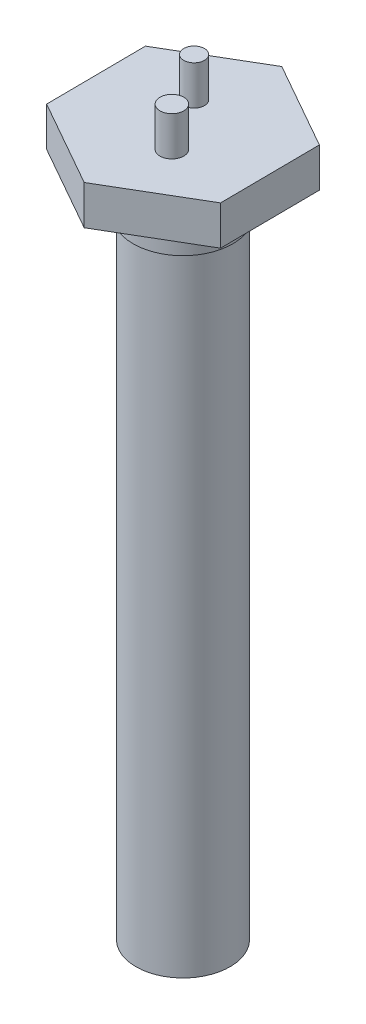
ISO-10303-21;
HEADER;
FILE_DESCRIPTION(('STEP AP214'),'2;1');
FILE_NAME('part.step','',(''),(''),'','','');
FILE_SCHEMA(('AUTOMOTIVE_DESIGN { 1 0 10303 214 1 1 1 1 }'));
ENDSEC;
DATA;
#1=APPLICATION_CONTEXT('core data for automotive mechanical design processes');
#2=APPLICATION_PROTOCOL_DEFINITION('international standard','automotive_design',2000,#1);
#3=PRODUCT_CONTEXT('',#1,'mechanical');
#4=PRODUCT('Part','Part','',(#3));
#5=PRODUCT_RELATED_PRODUCT_CATEGORY('part','',(#4));
#6=PRODUCT_DEFINITION_FORMATION('','',#4);
#7=PRODUCT_DEFINITION_CONTEXT('part definition',#1,'design');
#8=PRODUCT_DEFINITION('design','',#6,#7);
#9=PRODUCT_DEFINITION_SHAPE('','',#8);
#10=(LENGTH_UNIT() NAMED_UNIT(*) SI_UNIT(.MILLI.,.METRE.));
#11=(NAMED_UNIT(*) PLANE_ANGLE_UNIT() SI_UNIT($,.RADIAN.));
#12=(NAMED_UNIT(*) SI_UNIT($,.STERADIAN.) SOLID_ANGLE_UNIT());
#13=UNCERTAINTY_MEASURE_WITH_UNIT(LENGTH_MEASURE(1.E-05),#10,'distance_accuracy_value','');
#14=(GEOMETRIC_REPRESENTATION_CONTEXT(3) GLOBAL_UNCERTAINTY_ASSIGNED_CONTEXT((#13)) GLOBAL_UNIT_ASSIGNED_CONTEXT((#10,
#11,#12)) REPRESENTATION_CONTEXT('',''));
#15=CARTESIAN_POINT('',(0.,0.,0.));
#16=DIRECTION('',(0.,0.,1.));
#17=DIRECTION('',(1.,0.,0.));
#18=AXIS2_PLACEMENT_3D('',#15,#16,#17);
#19=CARTESIAN_POINT('',(3.81496896743502,180.,-6.73507861425368));
#20=DIRECTION('',(0.492858489126997,0.,-0.870109481442108));
#21=DIRECTION('',(-0.870109481442108,0.,-0.492858489126997));
#22=AXIS2_PLACEMENT_3D('',#19,#20,#21);
#23=PLANE('',#22);
#24=DIRECTION('',(0.,-1.,0.));
#25=VECTOR('',#24,1.);
#26=CARTESIAN_POINT('',(-30.4800376698685,180.,-26.1608928552934));
#27=LINE('',#26,#25);
#28=CARTESIAN_POINT('',(-30.4800376698685,180.,-26.1608928552934));
#29=VERTEX_POINT('',#28);
#30=CARTESIAN_POINT('',(-30.4800376698685,170.,-26.1608928552934));
#31=VERTEX_POINT('',#30);
#32=EDGE_CURVE('E127',#29,#31,#27,.T.);
#33=ORIENTED_EDGE('',*,*,#32,.T.);
#34=DIRECTION('',(0.870109481442108,0.,0.492858489126997));
#35=VECTOR('',#34,1.);
#36=CARTESIAN_POINT('',(3.81496896743502,170.,-6.73507861425368));
#37=LINE('',#36,#35);
#38=CARTESIAN_POINT('',(-8.37925684123895,170.,-13.6422872314676));
#39=VERTEX_POINT('',#38);
#40=EDGE_CURVE('E77',#31,#39,#37,.T.);
#41=ORIENTED_EDGE('',*,*,#40,.T.);
#42=DIRECTION('',(0.,-1.,0.));
#43=VECTOR('',#42,1.);
#44=CARTESIAN_POINT('',(-8.37925684123895,180.,-13.6422872314676));
#45=LINE('',#44,#43);
#46=CARTESIAN_POINT('',(-8.37925684123895,180.,-13.6422872314676));
#47=VERTEX_POINT('',#46);
#48=EDGE_CURVE('E12',#47,#39,#45,.T.);
#49=ORIENTED_EDGE('',*,*,#48,.F.);
#50=DIRECTION('',(0.870109481442108,0.,0.492858489126997));
#51=VECTOR('',#50,1.);
#52=CARTESIAN_POINT('',(3.81496896743502,180.,-6.73507861425368));
#53=LINE('',#52,#51);
#54=EDGE_CURVE('E136',#29,#47,#53,.T.);
#55=ORIENTED_EDGE('',*,*,#54,.F.);
#56=EDGE_LOOP('',(#33,#41,#49,#55));
#57=FACE_BOUND('',#56,.T.);
#58=ADVANCED_FACE('F62',(#57),#23,.F.);
#59=CARTESIAN_POINT('',(-8.11739263698819,180.,-13.7963608015956));
#60=DIRECTION('',(-0.507107670439071,0.,-0.86188271277585));
#61=DIRECTION('',(-0.86188271277585,0.,0.507107670439071));
#62=AXIS2_PLACEMENT_3D('',#59,#60,#61);
#63=PLANE('',#62);
#64=ORIENTED_EDGE('',*,*,#48,.T.);
#65=DIRECTION('',(0.86188271277585,0.,-0.507107670439071));
#66=VECTOR('',#65,1.);
#67=CARTESIAN_POINT('',(-8.11739263698819,170.,-13.7963608015956));
#68=LINE('',#67,#66);
#69=CARTESIAN_POINT('',(13.5125640632677,170.,-26.5228220606201));
#70=VERTEX_POINT('',#69);
#71=EDGE_CURVE('E114',#39,#70,#68,.T.);
#72=ORIENTED_EDGE('',*,*,#71,.T.);
#73=DIRECTION('',(0.,-1.,0.));
#74=VECTOR('',#73,1.);
#75=CARTESIAN_POINT('',(13.5125640632677,180.,-26.5228220606201));
#76=LINE('',#75,#74);
#77=CARTESIAN_POINT('',(13.5125640632677,180.,-26.5228220606201));
#78=VERTEX_POINT('',#77);
#79=EDGE_CURVE('E70',#78,#70,#76,.T.);
#80=ORIENTED_EDGE('',*,*,#79,.F.);
#81=DIRECTION('',(0.86188271277585,0.,-0.507107670439071));
#82=VECTOR('',#81,1.);
#83=CARTESIAN_POINT('',(-8.11739263698819,180.,-13.7963608015956));
#84=LINE('',#83,#82);
#85=EDGE_CURVE('E132',#47,#78,#84,.T.);
#86=ORIENTED_EDGE('',*,*,#85,.F.);
#87=EDGE_LOOP('',(#64,#72,#80,#86));
#88=FACE_BOUND('',#87,.T.);
#89=ADVANCED_FACE('F131',(#88),#63,.F.);
#90=CARTESIAN_POINT('',(13.7298392742628,180.,-0.112956034015472));
#91=DIRECTION('',(-0.999966159566068,0.,0.00822676866625814));
#92=DIRECTION('',(0.00822676866625814,0.,0.999966159566068));
#93=AXIS2_PLACEMENT_3D('',#90,#91,#92);
#94=PLANE('',#93);
#95=ORIENTED_EDGE('',*,*,#79,.T.);
#96=DIRECTION('',(-0.00822676866625814,0.,-0.999966159566069));
#97=VECTOR('',#96,1.);
#98=CARTESIAN_POINT('',(13.7298392742628,170.,-0.112956034015472));
#99=LINE('',#98,#97);
#100=CARTESIAN_POINT('',(13.3036041391447,170.,-51.9219625135982));
#101=VERTEX_POINT('',#100);
#102=EDGE_CURVE('E117',#70,#101,#99,.T.);
#103=ORIENTED_EDGE('',*,*,#102,.T.);
#104=DIRECTION('',(0.,-1.,0.));
#105=VECTOR('',#104,1.);
#106=CARTESIAN_POINT('',(13.3036041391447,180.,-51.9219625135982));
#107=LINE('',#106,#105);
#108=CARTESIAN_POINT('',(13.3036041391447,180.,-51.9219625135982));
#109=VERTEX_POINT('',#108);
#110=EDGE_CURVE('E167',#109,#101,#107,.T.);
#111=ORIENTED_EDGE('',*,*,#110,.F.);
#112=DIRECTION('',(-0.00822676866625814,0.,-0.999966159566069));
#113=VECTOR('',#112,1.);
#114=CARTESIAN_POINT('',(13.7298392742628,180.,-0.112956034015472));
#115=LINE('',#114,#113);
#116=EDGE_CURVE('E135',#78,#109,#115,.T.);
#117=ORIENTED_EDGE('',*,*,#116,.F.);
#118=EDGE_LOOP('',(#95,#103,#111,#117));
#119=FACE_BOUND('',#118,.T.);
#120=ADVANCED_FACE('F172',(#119),#94,.F.);
#121=CARTESIAN_POINT('',(25.4978299478187,180.,-45.0147538963843));
#122=DIRECTION('',(-0.492858489126997,0.,0.870109481442108));
#123=DIRECTION('',(0.870109481442108,0.,0.492858489126997));
#124=AXIS2_PLACEMENT_3D('',#121,#122,#123);
#125=PLANE('',#124);
#126=ORIENTED_EDGE('',*,*,#110,.T.);
#127=DIRECTION('',(-0.870109481442108,0.,-0.492858489126997));
#128=VECTOR('',#127,1.);
#129=CARTESIAN_POINT('',(25.4978299478187,170.,-45.0147538963843));
#130=LINE('',#129,#128);
#131=CARTESIAN_POINT('',(-8.79717668948483,170.,-64.4405681374239));
#132=VERTEX_POINT('',#131);
#133=EDGE_CURVE('E181',#101,#132,#130,.T.);
#134=ORIENTED_EDGE('',*,*,#133,.T.);
#135=DIRECTION('',(0.,-1.,0.));
#136=VECTOR('',#135,1.);
#137=CARTESIAN_POINT('',(-8.79717668948483,180.,-64.4405681374239));
#138=LINE('',#137,#136);
#139=CARTESIAN_POINT('',(-8.79717668948483,180.,-64.4405681374239));
#140=VERTEX_POINT('',#139);
#141=EDGE_CURVE('E163',#140,#132,#138,.T.);
#142=ORIENTED_EDGE('',*,*,#141,.F.);
#143=DIRECTION('',(-0.870109481442108,0.,-0.492858489126997));
#144=VECTOR('',#143,1.);
#145=CARTESIAN_POINT('',(25.4978299478187,180.,-45.0147538963843));
#146=LINE('',#145,#144);
#147=EDGE_CURVE('E149',#109,#140,#146,.T.);
#148=ORIENTED_EDGE('',*,*,#147,.F.);
#149=EDGE_LOOP('',(#126,#134,#142,#148));
#150=FACE_BOUND('',#149,.T.);
#151=ADVANCED_FACE('F180',(#150),#125,.F.);
#152=CARTESIAN_POINT('',(-30.4271333897407,180.,-51.7141068783995));
#153=DIRECTION('',(0.507107670439071,0.,0.86188271277585));
#154=DIRECTION('',(0.86188271277585,0.,-0.507107670439071));
#155=AXIS2_PLACEMENT_3D('',#152,#153,#154);
#156=PLANE('',#155);
#157=ORIENTED_EDGE('',*,*,#141,.T.);
#158=DIRECTION('',(-0.86188271277585,0.,0.507107670439071));
#159=VECTOR('',#158,1.);
#160=CARTESIAN_POINT('',(-30.4271333897407,170.,-51.7141068783995));
#161=LINE('',#160,#159);
#162=CARTESIAN_POINT('',(-30.6889975939914,170.,-51.5600333082715));
#163=VERTEX_POINT('',#162);
#164=EDGE_CURVE('E143',#132,#163,#161,.T.);
#165=ORIENTED_EDGE('',*,*,#164,.T.);
#166=DIRECTION('',(0.,-1.,0.));
#167=VECTOR('',#166,1.);
#168=CARTESIAN_POINT('',(-30.6889975939914,180.,-51.5600333082715));
#169=LINE('',#168,#167);
#170=CARTESIAN_POINT('',(-30.6889975939914,180.,-51.5600333082715));
#171=VERTEX_POINT('',#170);
#172=EDGE_CURVE('E159',#171,#163,#169,.T.);
#173=ORIENTED_EDGE('',*,*,#172,.F.);
#174=DIRECTION('',(-0.86188271277585,0.,0.507107670439071));
#175=VECTOR('',#174,1.);
#176=CARTESIAN_POINT('',(-30.4271333897407,180.,-51.7141068783995));
#177=LINE('',#176,#175);
#178=EDGE_CURVE('E152',#140,#171,#177,.T.);
#179=ORIENTED_EDGE('',*,*,#178,.F.);
#180=EDGE_LOOP('',(#157,#165,#173,#179));
#181=FACE_BOUND('',#180,.T.);
#182=ADVANCED_FACE('F184',(#181),#156,.F.);
#183=CARTESIAN_POINT('',(-30.2627624588734,180.,0.248973171311198));
#184=DIRECTION('',(0.999966159566068,0.,-0.00822676866625719));
#185=DIRECTION('',(-0.00822676866625719,0.,-0.999966159566068));
#186=AXIS2_PLACEMENT_3D('',#183,#184,#185);
#187=PLANE('',#186);
#188=ORIENTED_EDGE('',*,*,#172,.T.);
#189=DIRECTION('',(0.00822676866625719,0.,0.999966159566069));
#190=VECTOR('',#189,1.);
#191=CARTESIAN_POINT('',(-30.2627624588734,170.,0.248973171311198));
#192=LINE('',#191,#190);
#193=EDGE_CURVE('E140',#163,#31,#192,.T.);
#194=ORIENTED_EDGE('',*,*,#193,.T.);
#195=ORIENTED_EDGE('',*,*,#32,.F.);
#196=DIRECTION('',(0.00822676866625719,0.,0.999966159566069));
#197=VECTOR('',#196,1.);
#198=CARTESIAN_POINT('',(-30.2627624588734,180.,0.248973171311198));
#199=LINE('',#198,#197);
#200=EDGE_CURVE('E85',#171,#29,#199,.T.);
#201=ORIENTED_EDGE('',*,*,#200,.F.);
#202=EDGE_LOOP('',(#188,#194,#195,#201));
#203=FACE_BOUND('',#202,.T.);
#204=ADVANCED_FACE('F186',(#203),#187,.F.);
#205=CARTESIAN_POINT('',(0.,180.,0.));
#206=DIRECTION('',(0.,1.,0.));
#207=DIRECTION('',(0.,0.,1.));
#208=AXIS2_PLACEMENT_3D('',#205,#206,#207);
#209=PLANE('',#208);
#210=CARTESIAN_POINT('',(-12.6450781288745,180.,-45.9364893866526));
#211=DIRECTION('',(0.,1.,0.));
#212=DIRECTION('',(0.,0.,1.));
#213=AXIS2_PLACEMENT_3D('',#210,#211,#212);
#214=CIRCLE('',#213,2.63017223937022);
#215=CARTESIAN_POINT('',(-12.6450781288745,180.,-43.3063171472824));
#216=VERTEX_POINT('',#215);
#217=EDGE_CURVE('E216',#216,#216,#214,.F.);
#218=ORIENTED_EDGE('',*,*,#217,.T.);
#219=EDGE_LOOP('',(#218));
#220=FACE_BOUND('',#219,.T.);
#221=CARTESIAN_POINT('',(-4.53135540184932,180.,-32.146365982239));
#222=DIRECTION('',(0.,1.,0.));
#223=DIRECTION('',(0.,0.,1.));
#224=AXIS2_PLACEMENT_3D('',#221,#222,#223);
#225=CIRCLE('',#224,3.02673768436065);
#226=CARTESIAN_POINT('',(-4.53135540184932,180.,-29.1196282978783));
#227=VERTEX_POINT('',#226);
#228=EDGE_CURVE('E202',#227,#227,#225,.F.);
#229=ORIENTED_EDGE('',*,*,#228,.T.);
#230=EDGE_LOOP('',(#229));
#231=FACE_BOUND('',#230,.T.);
#232=ORIENTED_EDGE('',*,*,#54,.T.);
#233=ORIENTED_EDGE('',*,*,#85,.T.);
#234=ORIENTED_EDGE('',*,*,#116,.T.);
#235=ORIENTED_EDGE('',*,*,#147,.T.);
#236=ORIENTED_EDGE('',*,*,#178,.T.);
#237=ORIENTED_EDGE('',*,*,#200,.T.);
#238=EDGE_LOOP('',(#232,#233,#234,#235,#236,#237));
#239=FACE_BOUND('',#238,.T.);
#240=ADVANCED_FACE('F138',(#220,#231,#239),#209,.T.);
#241=CARTESIAN_POINT('',(-8.58821676536189,170.,-39.0414276844458));
#242=DIRECTION('',(0.,-1.,0.));
#243=DIRECTION('',(0.,0.,-1.));
#244=AXIS2_PLACEMENT_3D('',#241,#242,#243);
#245=CYLINDRICAL_SURFACE('',#244,12.7);
#246=CARTESIAN_POINT('',(-8.58821676536189,160.,-39.0414276844458));
#247=DIRECTION('',(0.,1.,0.));
#248=DIRECTION('',(0.,0.,1.));
#249=AXIS2_PLACEMENT_3D('',#246,#247,#248);
#250=CIRCLE('',#249,12.7);
#251=CARTESIAN_POINT('',(-8.58821676536189,160.,-26.3414276844458));
#252=VERTEX_POINT('',#251);
#253=EDGE_CURVE('E196',#252,#252,#250,.T.);
#254=ORIENTED_EDGE('',*,*,#253,.T.);
#255=EDGE_LOOP('',(#254));
#256=FACE_BOUND('',#255,.T.);
#257=CARTESIAN_POINT('',(-8.58821676536189,170.,-39.0414276844458));
#258=DIRECTION('',(0.,1.,0.));
#259=DIRECTION('',(0.,0.,1.));
#260=AXIS2_PLACEMENT_3D('',#257,#258,#259);
#261=CIRCLE('',#260,12.7);
#262=CARTESIAN_POINT('',(-8.58821676536189,170.,-26.3414276844458));
#263=VERTEX_POINT('',#262);
#264=EDGE_CURVE('E129',#263,#263,#261,.T.);
#265=ORIENTED_EDGE('',*,*,#264,.F.);
#266=EDGE_LOOP('',(#265));
#267=FACE_BOUND('',#266,.T.);
#268=ADVANCED_FACE('F263',(#256,#267),#245,.T.);
#269=CARTESIAN_POINT('',(0.,170.,0.));
#270=DIRECTION('',(0.,1.,0.));
#271=DIRECTION('',(0.,0.,1.));
#272=AXIS2_PLACEMENT_3D('',#269,#270,#271);
#273=PLANE('',#272);
#274=ORIENTED_EDGE('',*,*,#264,.T.);
#275=EDGE_LOOP('',(#274));
#276=FACE_BOUND('',#275,.T.);
#277=ORIENTED_EDGE('',*,*,#40,.F.);
#278=ORIENTED_EDGE('',*,*,#193,.F.);
#279=ORIENTED_EDGE('',*,*,#164,.F.);
#280=ORIENTED_EDGE('',*,*,#133,.F.);
#281=ORIENTED_EDGE('',*,*,#102,.F.);
#282=ORIENTED_EDGE('',*,*,#71,.F.);
#283=EDGE_LOOP('',(#277,#278,#279,#280,#281,#282));
#284=FACE_BOUND('',#283,.T.);
#285=ADVANCED_FACE('F115',(#276,#284),#273,.F.);
#286=CARTESIAN_POINT('',(-8.58821676536189,160.,-39.0414276844458));
#287=DIRECTION('',(0.,-1.,0.));
#288=DIRECTION('',(0.,0.,-1.));
#289=AXIS2_PLACEMENT_3D('',#286,#287,#288);
#290=CYLINDRICAL_SURFACE('',#289,12.);
#291=CARTESIAN_POINT('',(-8.58821676536189,160.,-39.0414276844458));
#292=DIRECTION('',(0.,1.,0.));
#293=DIRECTION('',(0.,0.,1.));
#294=AXIS2_PLACEMENT_3D('',#291,#292,#293);
#295=CIRCLE('',#294,12.);
#296=CARTESIAN_POINT('',(-8.58821676536189,160.,-27.0414276844458));
#297=VERTEX_POINT('',#296);
#298=EDGE_CURVE('E201',#297,#297,#295,.T.);
#299=ORIENTED_EDGE('',*,*,#298,.F.);
#300=EDGE_LOOP('',(#299));
#301=FACE_BOUND('',#300,.T.);
#302=CARTESIAN_POINT('',(-8.58821676536189,0.,-39.0414276844458));
#303=DIRECTION('',(0.,1.,0.));
#304=DIRECTION('',(0.,0.,1.));
#305=AXIS2_PLACEMENT_3D('',#302,#303,#304);
#306=CIRCLE('',#305,12.);
#307=CARTESIAN_POINT('',(-8.58821676536189,0.,-27.0414276844458));
#308=VERTEX_POINT('',#307);
#309=EDGE_CURVE('E197',#308,#308,#306,.T.);
#310=ORIENTED_EDGE('',*,*,#309,.T.);
#311=EDGE_LOOP('',(#310));
#312=FACE_BOUND('',#311,.T.);
#313=ADVANCED_FACE('F270',(#301,#312),#290,.T.);
#314=CARTESIAN_POINT('',(0.,160.,0.));
#315=DIRECTION('',(0.,1.,0.));
#316=DIRECTION('',(0.,0.,1.));
#317=AXIS2_PLACEMENT_3D('',#314,#315,#316);
#318=PLANE('',#317);
#319=ORIENTED_EDGE('',*,*,#298,.T.);
#320=EDGE_LOOP('',(#319));
#321=FACE_BOUND('',#320,.T.);
#322=ORIENTED_EDGE('',*,*,#253,.F.);
#323=EDGE_LOOP('',(#322));
#324=FACE_BOUND('',#323,.T.);
#325=ADVANCED_FACE('F259',(#321,#324),#318,.F.);
#326=CARTESIAN_POINT('',(0.,0.,0.));
#327=DIRECTION('',(0.,1.,0.));
#328=DIRECTION('',(0.,0.,1.));
#329=AXIS2_PLACEMENT_3D('',#326,#327,#328);
#330=PLANE('',#329);
#331=ORIENTED_EDGE('',*,*,#309,.F.);
#332=EDGE_LOOP('',(#331));
#333=FACE_BOUND('',#332,.T.);
#334=ADVANCED_FACE('F256',(#333),#330,.F.);
#335=CARTESIAN_POINT('',(-4.53135540184932,190.,-32.146365982239));
#336=DIRECTION('',(0.,-1.,0.));
#337=DIRECTION('',(0.,0.,-1.));
#338=AXIS2_PLACEMENT_3D('',#335,#336,#337);
#339=CYLINDRICAL_SURFACE('',#338,3.02673768436065);
#340=ORIENTED_EDGE('',*,*,#228,.F.);
#341=EDGE_LOOP('',(#340));
#342=FACE_BOUND('',#341,.T.);
#343=CARTESIAN_POINT('',(-4.53135540184932,190.,-32.146365982239));
#344=DIRECTION('',(0.,1.,0.));
#345=DIRECTION('',(0.,0.,1.));
#346=AXIS2_PLACEMENT_3D('',#343,#344,#345);
#347=CIRCLE('',#346,3.02673768436065);
#348=CARTESIAN_POINT('',(-4.53135540184932,190.,-29.1196282978783));
#349=VERTEX_POINT('',#348);
#350=EDGE_CURVE('E212',#349,#349,#347,.T.);
#351=ORIENTED_EDGE('',*,*,#350,.F.);
#352=EDGE_LOOP('',(#351));
#353=FACE_BOUND('',#352,.T.);
#354=ADVANCED_FACE('F237',(#342,#353),#339,.T.);
#355=CARTESIAN_POINT('',(0.,190.,0.));
#356=DIRECTION('',(0.,1.,0.));
#357=DIRECTION('',(0.,0.,1.));
#358=AXIS2_PLACEMENT_3D('',#355,#356,#357);
#359=PLANE('',#358);
#360=ORIENTED_EDGE('',*,*,#350,.T.);
#361=EDGE_LOOP('',(#360));
#362=FACE_BOUND('',#361,.T.);
#363=ADVANCED_FACE('F229',(#362),#359,.T.);
#364=CARTESIAN_POINT('',(-12.6450781288745,190.,-45.9364893866526));
#365=DIRECTION('',(0.,-1.,0.));
#366=DIRECTION('',(0.,0.,-1.));
#367=AXIS2_PLACEMENT_3D('',#364,#365,#366);
#368=CYLINDRICAL_SURFACE('',#367,2.63017223937022);
#369=ORIENTED_EDGE('',*,*,#217,.F.);
#370=EDGE_LOOP('',(#369));
#371=FACE_BOUND('',#370,.T.);
#372=CARTESIAN_POINT('',(-12.6450781288745,190.,-45.9364893866526));
#373=DIRECTION('',(0.,1.,0.));
#374=DIRECTION('',(0.,0.,1.));
#375=AXIS2_PLACEMENT_3D('',#372,#373,#374);
#376=CIRCLE('',#375,2.63017223937022);
#377=CARTESIAN_POINT('',(-12.6450781288745,190.,-43.3063171472824));
#378=VERTEX_POINT('',#377);
#379=EDGE_CURVE('E220',#378,#378,#376,.T.);
#380=ORIENTED_EDGE('',*,*,#379,.F.);
#381=EDGE_LOOP('',(#380));
#382=FACE_BOUND('',#381,.T.);
#383=ADVANCED_FACE('F227',(#371,#382),#368,.T.);
#384=CARTESIAN_POINT('',(-12.6450781288745,190.,-45.9364893866526));
#385=DIRECTION('',(0.,1.,0.));
#386=DIRECTION('',(0.,0.,1.));
#387=AXIS2_PLACEMENT_3D('',#384,#385,#386);
#388=PLANE('',#387);
#389=ORIENTED_EDGE('',*,*,#379,.T.);
#390=EDGE_LOOP('',(#389));
#391=FACE_BOUND('',#390,.T.);
#392=ADVANCED_FACE('F225',(#391),#388,.T.);
#393=CLOSED_SHELL('',(#58,#89,#120,#151,#182,#204,#240,#268,#285,#313,#325,#334,#354,#363,#383,#392));
#394=MANIFOLD_SOLID_BREP('B2',#393);
#395=ADVANCED_BREP_SHAPE_REPRESENTATION('',(#18,#394),#14);
#396=SHAPE_DEFINITION_REPRESENTATION(#9,#395);
ENDSEC;
END-ISO-10303-21;
